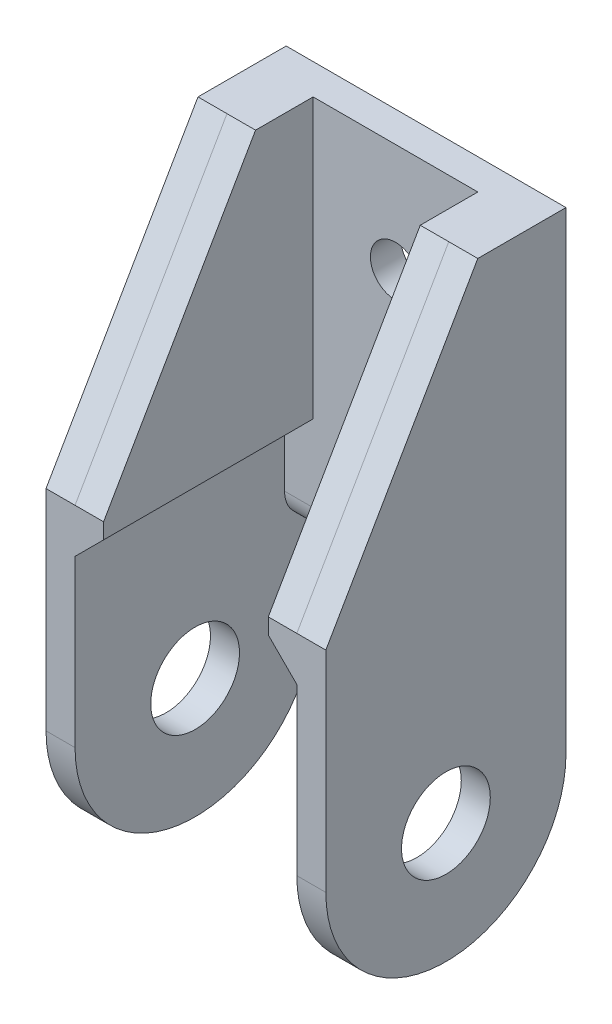
ISO-10303-21;
HEADER;
FILE_DESCRIPTION(('STEP AP214'),'2;1');
FILE_NAME('part.step','',(''),(''),'','','');
FILE_SCHEMA(('AUTOMOTIVE_DESIGN { 1 0 10303 214 1 1 1 1 }'));
ENDSEC;
DATA;
#1=APPLICATION_CONTEXT('core data for automotive mechanical design processes');
#2=APPLICATION_PROTOCOL_DEFINITION('international standard','automotive_design',2000,#1);
#3=PRODUCT_CONTEXT('',#1,'mechanical');
#4=PRODUCT('Part','Part','',(#3));
#5=PRODUCT_RELATED_PRODUCT_CATEGORY('part','',(#4));
#6=PRODUCT_DEFINITION_FORMATION('','',#4);
#7=PRODUCT_DEFINITION_CONTEXT('part definition',#1,'design');
#8=PRODUCT_DEFINITION('design','',#6,#7);
#9=PRODUCT_DEFINITION_SHAPE('','',#8);
#10=(LENGTH_UNIT() NAMED_UNIT(*) SI_UNIT(.MILLI.,.METRE.));
#11=(NAMED_UNIT(*) PLANE_ANGLE_UNIT() SI_UNIT($,.RADIAN.));
#12=(NAMED_UNIT(*) SI_UNIT($,.STERADIAN.) SOLID_ANGLE_UNIT());
#13=UNCERTAINTY_MEASURE_WITH_UNIT(LENGTH_MEASURE(1.E-05),#10,'distance_accuracy_value','');
#14=(GEOMETRIC_REPRESENTATION_CONTEXT(3) GLOBAL_UNCERTAINTY_ASSIGNED_CONTEXT((#13)) GLOBAL_UNIT_ASSIGNED_CONTEXT((#10,
#11,#12)) REPRESENTATION_CONTEXT('',''));
#15=CARTESIAN_POINT('',(0.,0.,0.));
#16=DIRECTION('',(0.,0.,1.));
#17=DIRECTION('',(1.,0.,0.));
#18=AXIS2_PLACEMENT_3D('',#15,#16,#17);
#19=CARTESIAN_POINT('',(8.92,19.9475,5.62207827597024));
#20=DIRECTION('',(0.,1.,0.));
#21=DIRECTION('',(1.,0.,0.));
#22=AXIS2_PLACEMENT_3D('',#19,#20,#21);
#23=PLANE('',#22);
#24=CARTESIAN_POINT('',(-8.92,19.9475,0.));
#25=CARTESIAN_POINT('',(8.92,19.9475,0.));
#26=(BOUNDED_CURVE() B_SPLINE_CURVE(1,(#24,#25),.UNSPECIFIED.,.F.,
.F.) B_SPLINE_CURVE_WITH_KNOTS((2,2),(-0.182,0.),
.UNSPECIFIED.) CURVE() GEOMETRIC_REPRESENTATION_ITEM() RATIONAL_B_SPLINE_CURVE((1.,1.)) REPRESENTATION_ITEM(''));
#27=CARTESIAN_POINT('',(-7.07,19.9475,0.));
#28=VERTEX_POINT('',#27);
#29=CARTESIAN_POINT('',(7.07,19.9475000013429,-1.55333731988172E-09));
#30=VERTEX_POINT('',#29);
#31=EDGE_CURVE('E145',#28,#30,#26,.T.);
#32=ORIENTED_EDGE('',*,*,#31,.F.);
#33=DIRECTION('',(1.,0.,0.));
#34=VECTOR('',#33,1.);
#35=CARTESIAN_POINT('',(-8.92,19.9475,0.));
#36=LINE('',#35,#34);
#37=CARTESIAN_POINT('',(-8.92,19.9475,0.));
#38=VERTEX_POINT('',#37);
#39=EDGE_CURVE('E445',#38,#28,#36,.T.);
#40=ORIENTED_EDGE('',*,*,#39,.F.);
#41=DIRECTION('',(0.,0.,-1.));
#42=VECTOR('',#41,1.);
#43=CARTESIAN_POINT('',(-8.92,19.9475,0.));
#44=LINE('',#43,#42);
#45=CARTESIAN_POINT('',(-8.92,19.9475,5.62206248299806));
#46=VERTEX_POINT('',#45);
#47=EDGE_CURVE('E458',#46,#38,#44,.T.);
#48=ORIENTED_EDGE('',*,*,#47,.F.);
#49=DIRECTION('',(1.,0.,0.));
#50=VECTOR('',#49,1.);
#51=CARTESIAN_POINT('',(-8.92,19.9475,5.62206248299806));
#52=LINE('',#51,#50);
#53=CARTESIAN_POINT('',(-7.07000000012178,19.9474899260201,5.62207179111762));
#54=VERTEX_POINT('',#53);
#55=EDGE_CURVE('E115',#46,#54,#52,.T.);
#56=ORIENTED_EDGE('',*,*,#55,.T.);
#57=CARTESIAN_POINT('',(-5.24999999999989,19.9474544202722,5.6220888046183));
#58=CARTESIAN_POINT('',(-6.47333333333323,19.9474696135148,5.6220800307449));
#59=CARTESIAN_POINT('',(-7.69666666666657,19.9474848067574,5.62207125687148));
#60=CARTESIAN_POINT('',(-8.92,19.9475,5.62206248299806));
#61=(BOUNDED_CURVE() B_SPLINE_CURVE(3,(#57,#58,#59,#60),.UNSPECIFIED.,.F.,
.F.) B_SPLINE_CURVE_WITH_KNOTS((4,4),(0.,1.82000000076109),
.UNSPECIFIED.) CURVE() GEOMETRIC_REPRESENTATION_ITEM() RATIONAL_B_SPLINE_CURVE((1.,1.,1.,1.)) REPRESENTATION_ITEM(''));
#62=CARTESIAN_POINT('',(-5.25,19.9474726521634,5.62207827597021));
#63=VERTEX_POINT('',#62);
#64=EDGE_CURVE('E105',#54,#63,#61,.F.);
#65=ORIENTED_EDGE('',*,*,#64,.T.);
#66=CARTESIAN_POINT('',(-5.25,19.9471392113303,1.94999997565309));
#67=DIRECTION('',(0.,9.08043904448818E-05,0.999999995877281));
#68=VECTOR('',#67,1.);
#69=LINE('',#66,#68);
#70=CARTESIAN_POINT('',(-5.25,19.9471392113303,1.94999997565309));
#71=VERTEX_POINT('',#70);
#72=EDGE_CURVE('E109',#71,#63,#69,.T.);
#73=ORIENTED_EDGE('',*,*,#72,.F.);
#74=CARTESIAN_POINT('',(-5.25,19.9475,1.94999997565309));
#75=DIRECTION('',(1.,0.,0.));
#76=VECTOR('',#75,1.);
#77=LINE('',#74,#76);
#78=CARTESIAN_POINT('',(5.25,19.9471392113302,1.94999997565309));
#79=VERTEX_POINT('',#78);
#80=EDGE_CURVE('E13',#71,#79,#77,.T.);
#81=ORIENTED_EDGE('',*,*,#80,.T.);
#82=CARTESIAN_POINT('',(5.25,19.9475,1.94999997565309));
#83=DIRECTION('',(0.,0.,1.));
#84=VECTOR('',#83,1.);
#85=LINE('',#82,#84);
#86=CARTESIAN_POINT('',(5.25,19.9474726521633,5.62207827597021));
#87=VERTEX_POINT('',#86);
#88=EDGE_CURVE('E64',#79,#87,#85,.T.);
#89=ORIENTED_EDGE('',*,*,#88,.T.);
#90=CARTESIAN_POINT('',(8.9199999999999,19.9475,5.62206248299806));
#91=CARTESIAN_POINT('',(7.69666666666656,19.9474848067574,5.62207125687148));
#92=CARTESIAN_POINT('',(6.47333333333323,19.9474696135148,5.6220800307449));
#93=CARTESIAN_POINT('',(5.2499999999999,19.9474544202722,5.6220888046183));
#94=(BOUNDED_CURVE() B_SPLINE_CURVE(3,(#90,#91,#92,#93),.UNSPECIFIED.,.F.,
.F.) B_SPLINE_CURVE_WITH_KNOTS((4,4),(0.,1.82000000076108),
.UNSPECIFIED.) CURVE() GEOMETRIC_REPRESENTATION_ITEM() RATIONAL_B_SPLINE_CURVE((1.,1.,1.,1.)) REPRESENTATION_ITEM(''));
#95=CARTESIAN_POINT('',(7.07,19.9474885122572,5.62206911700007));
#96=VERTEX_POINT('',#95);
#97=EDGE_CURVE('E122',#87,#96,#94,.F.);
#98=ORIENTED_EDGE('',*,*,#97,.T.);
#99=DIRECTION('',(-1.,0.,0.));
#100=VECTOR('',#99,1.);
#101=CARTESIAN_POINT('',(8.92,19.9475000013429,5.62206248377336));
#102=LINE('',#101,#100);
#103=CARTESIAN_POINT('',(8.92,19.9475000013429,5.62206248377336));
#104=VERTEX_POINT('',#103);
#105=EDGE_CURVE('E486',#104,#96,#102,.T.);
#106=ORIENTED_EDGE('',*,*,#105,.F.);
#107=DIRECTION('',(0.,0.,1.));
#108=VECTOR('',#107,1.);
#109=CARTESIAN_POINT('',(8.92,19.9475000013429,5.62206248377336));
#110=LINE('',#109,#108);
#111=CARTESIAN_POINT('',(8.92,19.9475000013429,-1.55333731988172E-09));
#112=VERTEX_POINT('',#111);
#113=EDGE_CURVE('E506',#112,#104,#110,.T.);
#114=ORIENTED_EDGE('',*,*,#113,.F.);
#115=DIRECTION('',(-1.,0.,0.));
#116=VECTOR('',#115,1.);
#117=CARTESIAN_POINT('',(8.92,19.9475000013429,-1.55333731988172E-09));
#118=LINE('',#117,#116);
#119=EDGE_CURVE('E482',#112,#30,#118,.T.);
#120=ORIENTED_EDGE('',*,*,#119,.T.);
#121=EDGE_LOOP('',(#32,#40,#48,#56,#65,#73,#81,#89,#98,#106,#114,#120));
#122=FACE_BOUND('',#121,.T.);
#123=ADVANCED_FACE('F53',(#122),#23,.T.);
#124=CARTESIAN_POINT('',(-8.92,-10.2125,0.));
#125=DIRECTION('',(0.,0.,-1.));
#126=DIRECTION('',(0.,-1.,0.));
#127=AXIS2_PLACEMENT_3D('',#124,#125,#126);
#128=PLANE('',#127);
#129=CARTESIAN_POINT('',(0.,12.9471392106589,0.));
#130=DIRECTION('',(0.,0.,-1.));
#131=DIRECTION('',(-1.,0.,0.));
#132=AXIS2_PLACEMENT_3D('',#129,#130,#131);
#133=CIRCLE('',#132,1.6);
#134=CARTESIAN_POINT('',(-1.6,12.9471392106589,0.));
#135=VERTEX_POINT('',#134);
#136=EDGE_CURVE('E517',#135,#135,#133,.T.);
#137=ORIENTED_EDGE('',*,*,#136,.F.);
#138=EDGE_LOOP('',(#137));
#139=FACE_BOUND('',#138,.T.);
#140=CARTESIAN_POINT('',(0.,3.94713921065887,0.));
#141=DIRECTION('',(0.,0.,-1.));
#142=DIRECTION('',(-1.,0.,0.));
#143=AXIS2_PLACEMENT_3D('',#140,#141,#142);
#144=CIRCLE('',#143,1.6);
#145=CARTESIAN_POINT('',(-1.6,3.94713921065887,0.));
#146=VERTEX_POINT('',#145);
#147=EDGE_CURVE('E514',#146,#146,#144,.T.);
#148=ORIENTED_EDGE('',*,*,#147,.F.);
#149=EDGE_LOOP('',(#148));
#150=FACE_BOUND('',#149,.T.);
#151=CARTESIAN_POINT('',(-7.07,-4.6825,0.));
#152=CARTESIAN_POINT('',(7.07,-4.6825,0.));
#153=(BOUNDED_CURVE() B_SPLINE_CURVE(1,(#151,#152),.UNSPECIFIED.,.F.,
.F.) B_SPLINE_CURVE_WITH_KNOTS((2,2),(55.538,57.452),
.UNSPECIFIED.) CURVE() GEOMETRIC_REPRESENTATION_ITEM() RATIONAL_B_SPLINE_CURVE((1.,1.)) REPRESENTATION_ITEM(''));
#154=CARTESIAN_POINT('',(-7.07,-4.6825,0.));
#155=VERTEX_POINT('',#154);
#156=CARTESIAN_POINT('',(7.07,-4.68249999999999,-1.55334015319048E-09));
#157=VERTEX_POINT('',#156);
#158=EDGE_CURVE('E324',#155,#157,#153,.T.);
#159=ORIENTED_EDGE('',*,*,#158,.F.);
#160=DIRECTION('',(0.,-1.,0.));
#161=VECTOR('',#160,1.);
#162=CARTESIAN_POINT('',(-7.07,-10.2125,0.));
#163=LINE('',#162,#161);
#164=CARTESIAN_POINT('',(-7.07,-10.2125,0.));
#165=VERTEX_POINT('',#164);
#166=EDGE_CURVE('E462',#155,#165,#163,.T.);
#167=ORIENTED_EDGE('',*,*,#166,.T.);
#168=DIRECTION('',(1.,0.,0.));
#169=VECTOR('',#168,1.);
#170=CARTESIAN_POINT('',(-8.92,-10.2125,0.));
#171=LINE('',#170,#169);
#172=CARTESIAN_POINT('',(-8.92,-10.2125,0.));
#173=VERTEX_POINT('',#172);
#174=EDGE_CURVE('E448',#173,#165,#171,.T.);
#175=ORIENTED_EDGE('',*,*,#174,.F.);
#176=DIRECTION('',(0.,-1.,0.));
#177=VECTOR('',#176,1.);
#178=CARTESIAN_POINT('',(-8.92,-10.2125,0.));
#179=LINE('',#178,#177);
#180=EDGE_CURVE('E475',#38,#173,#179,.T.);
#181=ORIENTED_EDGE('',*,*,#180,.F.);
#182=ORIENTED_EDGE('',*,*,#39,.T.);
#183=ORIENTED_EDGE('',*,*,#31,.T.);
#184=ORIENTED_EDGE('',*,*,#119,.F.);
#185=DIRECTION('',(0.,1.,0.));
#186=VECTOR('',#185,1.);
#187=CARTESIAN_POINT('',(8.92,19.9475000013429,-1.55333731988172E-09));
#188=LINE('',#187,#186);
#189=CARTESIAN_POINT('',(8.92,-10.2124598604409,-1.55334078932867E-09));
#190=VERTEX_POINT('',#189);
#191=EDGE_CURVE('E509',#190,#112,#188,.T.);
#192=ORIENTED_EDGE('',*,*,#191,.F.);
#193=DIRECTION('',(-1.,0.,0.));
#194=VECTOR('',#193,1.);
#195=CARTESIAN_POINT('',(8.92,-10.2124598604409,-1.55334078932867E-09));
#196=LINE('',#195,#194);
#197=CARTESIAN_POINT('',(7.07,-10.2124598604409,-1.55334078932867E-09));
#198=VERTEX_POINT('',#197);
#199=EDGE_CURVE('E465',#190,#198,#196,.T.);
#200=ORIENTED_EDGE('',*,*,#199,.T.);
#201=DIRECTION('',(0.,1.,0.));
#202=VECTOR('',#201,1.);
#203=CARTESIAN_POINT('',(7.07,19.9475000013429,-1.55333731988172E-09));
#204=LINE('',#203,#202);
#205=EDGE_CURVE('E495',#198,#157,#204,.T.);
#206=ORIENTED_EDGE('',*,*,#205,.T.);
#207=EDGE_LOOP('',(#159,#167,#175,#181,#182,#183,#184,#192,#200,#206));
#208=FACE_BOUND('',#207,.T.);
#209=ADVANCED_FACE('F188',(#139,#150,#208),#128,.T.);
#210=CARTESIAN_POINT('',(-8.92,10.2629827701714,15.31));
#211=DIRECTION('',(0.,0.,1.));
#212=DIRECTION('',(1.,0.,0.));
#213=AXIS2_PLACEMENT_3D('',#210,#211,#212);
#214=PLANE('',#213);
#215=CARTESIAN_POINT('',(-8.92,3.1675,15.31));
#216=CARTESIAN_POINT('',(-7.07,3.1675,15.31));
#217=CARTESIAN_POINT('',(-5.25,3.1675,15.31));
#218=(BOUNDED_CURVE() B_SPLINE_CURVE(1,(#215,#216,#217),.UNSPECIFIED.,.F.,
.F.) B_SPLINE_CURVE_WITH_KNOTS((2,1,2),(-1.82000000076109,-0.902561308279338,0.),
.UNSPECIFIED.) CURVE() GEOMETRIC_REPRESENTATION_ITEM() RATIONAL_B_SPLINE_CURVE((1.,1.,1.)) REPRESENTATION_ITEM(''));
#219=CARTESIAN_POINT('',(-7.07,3.1675,15.31));
#220=VERTEX_POINT('',#219);
#221=CARTESIAN_POINT('',(-5.25,3.1675,15.31));
#222=VERTEX_POINT('',#221);
#223=EDGE_CURVE('E123',#220,#222,#218,.T.);
#224=ORIENTED_EDGE('',*,*,#223,.F.);
#225=DIRECTION('',(1.,0.,0.));
#226=VECTOR('',#225,1.);
#227=CARTESIAN_POINT('',(-8.92,3.1675,15.31));
#228=LINE('',#227,#226);
#229=CARTESIAN_POINT('',(-8.92,3.1675,15.31));
#230=VERTEX_POINT('',#229);
#231=EDGE_CURVE('E454',#230,#220,#228,.T.);
#232=ORIENTED_EDGE('',*,*,#231,.F.);
#233=DIRECTION('',(0.,1.,0.));
#234=VECTOR('',#233,1.);
#235=CARTESIAN_POINT('',(-8.92,3.1675,15.31));
#236=LINE('',#235,#234);
#237=CARTESIAN_POINT('',(-8.92,-10.2125,15.31));
#238=VERTEX_POINT('',#237);
#239=EDGE_CURVE('E469',#238,#230,#236,.T.);
#240=ORIENTED_EDGE('',*,*,#239,.F.);
#241=DIRECTION('',(1.,0.,0.));
#242=VECTOR('',#241,1.);
#243=CARTESIAN_POINT('',(-8.92,-10.2125,15.31));
#244=LINE('',#243,#242);
#245=CARTESIAN_POINT('',(-7.07,-10.2125,15.31));
#246=VERTEX_POINT('',#245);
#247=EDGE_CURVE('E451',#238,#246,#244,.T.);
#248=ORIENTED_EDGE('',*,*,#247,.T.);
#249=DIRECTION('',(0.,1.,0.));
#250=VECTOR('',#249,1.);
#251=CARTESIAN_POINT('',(-7.07,3.1675,15.31));
#252=LINE('',#251,#250);
#253=CARTESIAN_POINT('',(-7.07,0.347499999999975,15.31));
#254=VERTEX_POINT('',#253);
#255=EDGE_CURVE('E455',#246,#254,#252,.T.);
#256=ORIENTED_EDGE('',*,*,#255,.T.);
#257=CARTESIAN_POINT('',(-5.25,2.1675,15.31));
#258=CARTESIAN_POINT('',(-7.07,0.347499999999975,15.31));
#259=(BOUNDED_CURVE() B_SPLINE_CURVE(1,(#257,#258),.UNSPECIFIED.,.F.,
.F.) B_SPLINE_CURVE_WITH_KNOTS((2,2),(-2.57386868351903,0.),
.UNSPECIFIED.) CURVE() GEOMETRIC_REPRESENTATION_ITEM() RATIONAL_B_SPLINE_CURVE((1.,1.)) REPRESENTATION_ITEM(''));
#260=CARTESIAN_POINT('',(-5.25,2.1675,15.31));
#261=VERTEX_POINT('',#260);
#262=EDGE_CURVE('E139',#261,#254,#259,.T.);
#263=ORIENTED_EDGE('',*,*,#262,.F.);
#264=CARTESIAN_POINT('',(-5.25,3.1675,15.31));
#265=CARTESIAN_POINT('',(-5.25,2.1675,15.31));
#266=(BOUNDED_CURVE() B_SPLINE_CURVE(1,(#264,#265),.UNSPECIFIED.,.F.,
.F.) B_SPLINE_CURVE_WITH_KNOTS((2,2),(1.03100000076109,1.13100000076109),
.UNSPECIFIED.) CURVE() GEOMETRIC_REPRESENTATION_ITEM() RATIONAL_B_SPLINE_CURVE((1.,1.)) REPRESENTATION_ITEM(''));
#267=EDGE_CURVE('E72',#222,#261,#266,.T.);
#268=ORIENTED_EDGE('',*,*,#267,.F.);
#269=EDGE_LOOP('',(#224,#232,#240,#248,#256,#263,#268));
#270=FACE_BOUND('',#269,.T.);
#271=ADVANCED_FACE('F191',(#270),#214,.T.);
#272=CARTESIAN_POINT('',(-5.25,3.1675,15.31));
#273=CARTESIAN_POINT('',(-6.47333333333334,3.1675,15.31));
#274=CARTESIAN_POINT('',(-7.69666666666668,3.1675,15.31));
#275=CARTESIAN_POINT('',(-8.92,3.1675,15.31));
#276=CARTESIAN_POINT('',(-5.24999999999989,19.9474544202722,5.6220888046183));
#277=CARTESIAN_POINT('',(-6.47333333333323,19.9474696135148,5.6220800307449));
#278=CARTESIAN_POINT('',(-7.69666666666657,19.9474848067574,5.62207125687148));
#279=CARTESIAN_POINT('',(-8.92,19.9475,5.62206248299806));
#280=(BOUNDED_SURFACE() B_SPLINE_SURFACE(1,3,((#272,#273,#274,#275),(#276,#277,#278,#279)),
.UNSPECIFIED.,.F.,.F.,.F.) B_SPLINE_SURFACE_WITH_KNOTS((2,2),(4,4),(0.,19.3758750340038),(0.,
1.82000000076109),.UNSPECIFIED.) GEOMETRIC_REPRESENTATION_ITEM() RATIONAL_B_SPLINE_SURFACE(((1.,
1.,1.,1.),(1.,1.,1.,1.))) REPRESENTATION_ITEM('') SURFACE());
#281=CARTESIAN_POINT('',(-7.07,3.1675,15.31));
#282=CARTESIAN_POINT('',(-7.07,19.9475,5.62206248299806));
#283=(BOUNDED_CURVE() B_SPLINE_CURVE(1,(#281,#282),.UNSPECIFIED.,.F.,
.F.) B_SPLINE_CURVE_WITH_KNOTS((2,2),(0.,19.3758750340038),
.UNSPECIFIED.) CURVE() GEOMETRIC_REPRESENTATION_ITEM() RATIONAL_B_SPLINE_CURVE((1.,1.)) REPRESENTATION_ITEM(''));
#284=EDGE_CURVE('E439',#220,#54,#283,.T.);
#285=CARTESIAN_POINT('',(-5.25,19.9474726521634,5.62207827597021));
#286=CARTESIAN_POINT('',(-5.25,3.1675,15.31));
#287=(BOUNDED_CURVE() B_SPLINE_CURVE(1,(#285,#286),.UNSPECIFIED.,.F.,
.F.) B_SPLINE_CURVE_WITH_KNOTS((2,2),(-19.3758750340038,0.),
.UNSPECIFIED.) CURVE() GEOMETRIC_REPRESENTATION_ITEM() RATIONAL_B_SPLINE_CURVE((1.,1.)) REPRESENTATION_ITEM(''));
#288=EDGE_CURVE('E129',#63,#222,#287,.T.);
#289=ORIENTED_EDGE('',*,*,#64,.F.);
#290=ORIENTED_EDGE('',*,*,#284,.F.);
#291=ORIENTED_EDGE('',*,*,#223,.T.);
#292=ORIENTED_EDGE('',*,*,#288,.F.);
#293=EDGE_LOOP('',(#289,#290,#291,#292));
#294=FACE_BOUND('',#293,.T.);
#295=ADVANCED_FACE('F136',(#294),#280,.T.);
#296=CARTESIAN_POINT('',(-18.92,10.2629827701714,15.31));
#297=DIRECTION('',(0.,0.,1.));
#298=DIRECTION('',(1.,0.,0.));
#299=AXIS2_PLACEMENT_3D('',#296,#297,#298);
#300=PLANE('',#299);
#301=CARTESIAN_POINT('',(7.07,0.347499999999975,15.31));
#302=CARTESIAN_POINT('',(5.25,2.1675,15.31));
#303=(BOUNDED_CURVE() B_SPLINE_CURVE(1,(#301,#302),.UNSPECIFIED.,.F.,
.F.) B_SPLINE_CURVE_WITH_KNOTS((2,2),(0.,2.57386868351903),
.UNSPECIFIED.) CURVE() GEOMETRIC_REPRESENTATION_ITEM() RATIONAL_B_SPLINE_CURVE((1.,1.)) REPRESENTATION_ITEM(''));
#304=CARTESIAN_POINT('',(7.07,0.347499999999972,15.3100000013433));
#305=VERTEX_POINT('',#304);
#306=CARTESIAN_POINT('',(5.25,2.1675,15.31));
#307=VERTEX_POINT('',#306);
#308=EDGE_CURVE('E622',#305,#307,#303,.T.);
#309=ORIENTED_EDGE('',*,*,#308,.F.);
#310=DIRECTION('',(0.,-1.,0.));
#311=VECTOR('',#310,1.);
#312=CARTESIAN_POINT('',(7.07,-10.2124598604409,15.3100000013429));
#313=LINE('',#312,#311);
#314=CARTESIAN_POINT('',(7.07,-10.2124598604409,15.3100000013429));
#315=VERTEX_POINT('',#314);
#316=EDGE_CURVE('E491',#305,#315,#313,.T.);
#317=ORIENTED_EDGE('',*,*,#316,.T.);
#318=DIRECTION('',(-1.,0.,0.));
#319=VECTOR('',#318,1.);
#320=CARTESIAN_POINT('',(8.92,-10.2124598604409,15.3100000013429));
#321=LINE('',#320,#319);
#322=CARTESIAN_POINT('',(8.92,-10.2124598604409,15.3100000013429));
#323=VERTEX_POINT('',#322);
#324=EDGE_CURVE('E487',#323,#315,#321,.T.);
#325=ORIENTED_EDGE('',*,*,#324,.F.);
#326=DIRECTION('',(0.,-1.,0.));
#327=VECTOR('',#326,1.);
#328=CARTESIAN_POINT('',(8.92,-10.2124598604409,15.3100000013429));
#329=LINE('',#328,#327);
#330=CARTESIAN_POINT('',(8.92,3.16750000035981,15.3100000013429));
#331=VERTEX_POINT('',#330);
#332=EDGE_CURVE('E490',#331,#323,#329,.T.);
#333=ORIENTED_EDGE('',*,*,#332,.F.);
#334=DIRECTION('',(-1.,0.,0.));
#335=VECTOR('',#334,1.);
#336=CARTESIAN_POINT('',(8.92,3.16750000035981,15.3100000013429));
#337=LINE('',#336,#335);
#338=CARTESIAN_POINT('',(7.07,3.16750000035981,15.3100000013429));
#339=VERTEX_POINT('',#338);
#340=EDGE_CURVE('E483',#331,#339,#337,.T.);
#341=ORIENTED_EDGE('',*,*,#340,.T.);
#342=CARTESIAN_POINT('',(5.25,3.1675,15.31));
#343=CARTESIAN_POINT('',(7.07,3.1675,15.31));
#344=CARTESIAN_POINT('',(8.92,3.1675,15.31));
#345=(BOUNDED_CURVE() B_SPLINE_CURVE(1,(#342,#343,#344),.UNSPECIFIED.,.F.,
.F.) B_SPLINE_CURVE_WITH_KNOTS((2,1,2),(-1.82000000076108,-0.917438692481745,0.),
.UNSPECIFIED.) CURVE() GEOMETRIC_REPRESENTATION_ITEM() RATIONAL_B_SPLINE_CURVE((1.,1.,1.)) REPRESENTATION_ITEM(''));
#346=CARTESIAN_POINT('',(5.25,3.1675,15.31));
#347=VERTEX_POINT('',#346);
#348=EDGE_CURVE('E703',#347,#339,#345,.T.);
#349=ORIENTED_EDGE('',*,*,#348,.F.);
#350=CARTESIAN_POINT('',(5.25,2.1675,15.31));
#351=CARTESIAN_POINT('',(5.25,3.1675,15.31));
#352=(BOUNDED_CURVE() B_SPLINE_CURVE(1,(#350,#351),.UNSPECIFIED.,.F.,
.F.) B_SPLINE_CURVE_WITH_KNOTS((2,2),(4.35386868351903,4.45386868351903),
.UNSPECIFIED.) CURVE() GEOMETRIC_REPRESENTATION_ITEM() RATIONAL_B_SPLINE_CURVE((1.,1.)) REPRESENTATION_ITEM(''));
#353=EDGE_CURVE('E224',#307,#347,#352,.T.);
#354=ORIENTED_EDGE('',*,*,#353,.F.);
#355=EDGE_LOOP('',(#309,#317,#325,#333,#341,#349,#354));
#356=FACE_BOUND('',#355,.T.);
#357=ADVANCED_FACE('F654',(#356),#300,.T.);
#358=CARTESIAN_POINT('',(8.92,3.1675,15.31));
#359=CARTESIAN_POINT('',(7.69666666666666,3.1675,15.31));
#360=CARTESIAN_POINT('',(6.47333333333333,3.1675,15.31));
#361=CARTESIAN_POINT('',(5.25,3.1675,15.31));
#362=CARTESIAN_POINT('',(8.9199999999999,19.9475,5.62206248299806));
#363=CARTESIAN_POINT('',(7.69666666666656,19.9474848067574,5.62207125687148));
#364=CARTESIAN_POINT('',(6.47333333333323,19.9474696135148,5.6220800307449));
#365=CARTESIAN_POINT('',(5.2499999999999,19.9474544202722,5.6220888046183));
#366=(BOUNDED_SURFACE() B_SPLINE_SURFACE(1,3,((#358,#359,#360,#361),(#362,#363,#364,#365)),
.UNSPECIFIED.,.F.,.F.,.F.) B_SPLINE_SURFACE_WITH_KNOTS((2,2),(4,4),(0.,19.3758750340038),(0.,
1.82000000076108),.UNSPECIFIED.) GEOMETRIC_REPRESENTATION_ITEM() RATIONAL_B_SPLINE_SURFACE(((1.,
1.,1.,1.),(1.,1.,1.,1.))) REPRESENTATION_ITEM('') SURFACE());
#367=CARTESIAN_POINT('',(7.07,3.16750000035981,15.3100000013429));
#368=CARTESIAN_POINT('',(7.07,4.45268169957763,14.5680000013458));
#369=CARTESIAN_POINT('',(7.07,5.73786339879465,13.8260000013474));
#370=CARTESIAN_POINT('',(7.07,9.17712091523428,11.840343748421));
#371=CARTESIAN_POINT('',(7.07,11.331196732456,10.5966874954914));
#372=CARTESIAN_POINT('',(7.07,15.639348366899,8.10937498963166));
#373=CARTESIAN_POINT('',(7.07,17.7934241841204,6.86571873670152));
#374=CARTESIAN_POINT('',(7.07,19.9475000013429,5.62206248377336));
#375=B_SPLINE_CURVE_WITH_KNOTS('',3,(#367,#368,#369,#370,#371,#372,#373,#374),.UNSPECIFIED.,.F.,
.F.,(4,2,2,4),(0.,4.45200000000001,11.9139375175695,19.375875035139),.UNSPECIFIED.);
#376=EDGE_CURVE('E417',#339,#96,#375,.T.);
#377=CARTESIAN_POINT('',(5.25,3.1675,15.31));
#378=CARTESIAN_POINT('',(5.25,19.9474726521633,5.62207827597021));
#379=(BOUNDED_CURVE() B_SPLINE_CURVE(1,(#377,#378),.UNSPECIFIED.,.F.,
.F.) B_SPLINE_CURVE_WITH_KNOTS((2,2),(0.,19.3758750340038),
.UNSPECIFIED.) CURVE() GEOMETRIC_REPRESENTATION_ITEM() RATIONAL_B_SPLINE_CURVE((1.,1.)) REPRESENTATION_ITEM(''));
#380=EDGE_CURVE('E215',#347,#87,#379,.T.);
#381=ORIENTED_EDGE('',*,*,#348,.T.);
#382=ORIENTED_EDGE('',*,*,#376,.T.);
#383=ORIENTED_EDGE('',*,*,#97,.F.);
#384=ORIENTED_EDGE('',*,*,#380,.F.);
#385=EDGE_LOOP('',(#381,#382,#383,#384));
#386=FACE_BOUND('',#385,.T.);
#387=ADVANCED_FACE('F757',(#386),#366,.T.);
#388=CARTESIAN_POINT('',(-12.0691047558312,-4.65160475583124,15.31));
#389=DIRECTION('',(0.707106781186547,-0.707106781186548,0.));
#390=DIRECTION('',(0.,0.,-1.));
#391=AXIS2_PLACEMENT_3D('',#388,#389,#390);
#392=PLANE('',#391);
#393=CARTESIAN_POINT('',(-7.07,0.347499999999975,1.95));
#394=CARTESIAN_POINT('',(-7.07,0.347499999999975,13.34));
#395=CARTESIAN_POINT('',(-7.07,0.347499999999975,15.31));
#396=(BOUNDED_CURVE() B_SPLINE_CURVE(1,(#393,#394,#395),.UNSPECIFIED.,.F.,
.F.) B_SPLINE_CURVE_WITH_KNOTS((2,1,2),(-1.139,0.,0.197),
.UNSPECIFIED.) CURVE() GEOMETRIC_REPRESENTATION_ITEM() RATIONAL_B_SPLINE_CURVE((1.,1.,1.)) REPRESENTATION_ITEM(''));
#397=CARTESIAN_POINT('',(-7.07,0.347499999999974,1.95));
#398=VERTEX_POINT('',#397);
#399=EDGE_CURVE('E252',#398,#254,#396,.T.);
#400=ORIENTED_EDGE('',*,*,#399,.F.);
#401=CARTESIAN_POINT('',(-5.25,2.1675,1.95));
#402=CARTESIAN_POINT('',(-7.07,0.347499999999975,1.95));
#403=(BOUNDED_CURVE() B_SPLINE_CURVE(1,(#401,#402),.UNSPECIFIED.,.F.,
.F.) B_SPLINE_CURVE_WITH_KNOTS((2,2),(0.,0.257386868351903),
.UNSPECIFIED.) CURVE() GEOMETRIC_REPRESENTATION_ITEM() RATIONAL_B_SPLINE_CURVE((1.,1.)) REPRESENTATION_ITEM(''));
#404=CARTESIAN_POINT('',(-5.25,2.1675,1.95));
#405=VERTEX_POINT('',#404);
#406=EDGE_CURVE('E332',#405,#398,#403,.T.);
#407=ORIENTED_EDGE('',*,*,#406,.F.);
#408=CARTESIAN_POINT('',(-5.25,2.1675,15.31));
#409=CARTESIAN_POINT('',(-5.25,2.1675,13.34));
#410=CARTESIAN_POINT('',(-5.25,2.1675,1.95));
#411=(BOUNDED_CURVE() B_SPLINE_CURVE(1,(#408,#409,#410),.UNSPECIFIED.,.F.,
.F.) B_SPLINE_CURVE_WITH_KNOTS((2,1,2),(-0.7655,-0.5685,0.5705),
.UNSPECIFIED.) CURVE() GEOMETRIC_REPRESENTATION_ITEM() RATIONAL_B_SPLINE_CURVE((1.,1.,1.)) REPRESENTATION_ITEM(''));
#412=EDGE_CURVE('E147',#261,#405,#411,.T.);
#413=ORIENTED_EDGE('',*,*,#412,.F.);
#414=ORIENTED_EDGE('',*,*,#262,.T.);
#415=EDGE_LOOP('',(#400,#407,#413,#414));
#416=FACE_BOUND('',#415,.T.);
#417=ADVANCED_FACE('F183',(#416),#392,.T.);
#418=CARTESIAN_POINT('',(-5.25,2.1675,0.));
#419=DIRECTION('',(1.,0.,0.));
#420=DIRECTION('',(0.,1.,0.));
#421=AXIS2_PLACEMENT_3D('',#418,#419,#420);
#422=PLANE('',#421);
#423=ORIENTED_EDGE('',*,*,#288,.T.);
#424=ORIENTED_EDGE('',*,*,#267,.T.);
#425=ORIENTED_EDGE('',*,*,#412,.T.);
#426=CARTESIAN_POINT('',(-5.25,2.1675,1.95));
#427=CARTESIAN_POINT('',(-5.25,4.61752485824371,1.949999996645));
#428=CARTESIAN_POINT('',(-5.25,13.1176111011301,1.94999998500523));
#429=CARTESIAN_POINT('',(-5.25,19.9471392113303,1.94999997565309));
#430=(BOUNDED_CURVE() B_SPLINE_CURVE(1,(#426,#427,#428,#429),.UNSPECIFIED.,.F.,
.F.) B_SPLINE_CURVE_WITH_KNOTS((2,1,1,2),(-0.245,0.,0.85,1.45),
.UNSPECIFIED.) CURVE() GEOMETRIC_REPRESENTATION_ITEM() RATIONAL_B_SPLINE_CURVE((1.,1.,1.,1.)) REPRESENTATION_ITEM(''));
#431=EDGE_CURVE('E131',#405,#71,#430,.T.);
#432=ORIENTED_EDGE('',*,*,#431,.T.);
#433=ORIENTED_EDGE('',*,*,#72,.T.);
#434=EDGE_LOOP('',(#423,#424,#425,#432,#433));
#435=FACE_BOUND('',#434,.T.);
#436=ADVANCED_FACE('F128',(#435),#422,.T.);
#437=CARTESIAN_POINT('',(12.0691047558312,-4.65160475583123,15.31));
#438=DIRECTION('',(-0.707106781186547,-0.707106781186548,0.));
#439=DIRECTION('',(-0.707106781186548,0.707106781186547,0.));
#440=AXIS2_PLACEMENT_3D('',#437,#438,#439);
#441=PLANE('',#440);
#442=ORIENTED_EDGE('',*,*,#308,.T.);
#443=CARTESIAN_POINT('',(5.25,2.1675,15.31));
#444=CARTESIAN_POINT('',(5.25,2.1675,13.34));
#445=CARTESIAN_POINT('',(5.25,2.1675,1.95));
#446=(BOUNDED_CURVE() B_SPLINE_CURVE(1,(#443,#444,#445),.UNSPECIFIED.,.F.,
.F.) B_SPLINE_CURVE_WITH_KNOTS((2,1,2),(-0.7655,-0.5685,0.5705),
.UNSPECIFIED.) CURVE() GEOMETRIC_REPRESENTATION_ITEM() RATIONAL_B_SPLINE_CURVE((1.,1.,1.)) REPRESENTATION_ITEM(''));
#447=CARTESIAN_POINT('',(5.25,2.1675,1.95));
#448=VERTEX_POINT('',#447);
#449=EDGE_CURVE('E293',#307,#448,#446,.T.);
#450=ORIENTED_EDGE('',*,*,#449,.T.);
#451=CARTESIAN_POINT('',(7.07,0.347499999999975,1.95));
#452=CARTESIAN_POINT('',(5.25,2.1675,1.95));
#453=(BOUNDED_CURVE() B_SPLINE_CURVE(1,(#451,#452),.UNSPECIFIED.,.F.,
.F.) B_SPLINE_CURVE_WITH_KNOTS((2,2),(-0.257386868351903,0.),
.UNSPECIFIED.) CURVE() GEOMETRIC_REPRESENTATION_ITEM() RATIONAL_B_SPLINE_CURVE((1.,1.)) REPRESENTATION_ITEM(''));
#454=CARTESIAN_POINT('',(7.07,0.347499999999975,1.95));
#455=VERTEX_POINT('',#454);
#456=EDGE_CURVE('E245',#455,#448,#453,.T.);
#457=ORIENTED_EDGE('',*,*,#456,.F.);
#458=CARTESIAN_POINT('',(7.07,0.347499999999975,1.95));
#459=CARTESIAN_POINT('',(7.07,0.347499999999975,13.34));
#460=CARTESIAN_POINT('',(7.07,0.347499999999975,15.31));
#461=(BOUNDED_CURVE() B_SPLINE_CURVE(1,(#458,#459,#460),.UNSPECIFIED.,.F.,
.F.) B_SPLINE_CURVE_WITH_KNOTS((2,1,2),(-1.139,0.,0.197),
.UNSPECIFIED.) CURVE() GEOMETRIC_REPRESENTATION_ITEM() RATIONAL_B_SPLINE_CURVE((1.,1.,1.)) REPRESENTATION_ITEM(''));
#462=EDGE_CURVE('E264',#455,#305,#461,.T.);
#463=ORIENTED_EDGE('',*,*,#462,.T.);
#464=EDGE_LOOP('',(#442,#450,#457,#463));
#465=FACE_BOUND('',#464,.T.);
#466=ADVANCED_FACE('F55',(#465),#441,.T.);
#467=CARTESIAN_POINT('',(5.25,2.1675,0.));
#468=DIRECTION('',(-1.,0.,0.));
#469=DIRECTION('',(0.,0.,1.));
#470=AXIS2_PLACEMENT_3D('',#467,#468,#469);
#471=PLANE('',#470);
#472=ORIENTED_EDGE('',*,*,#88,.F.);
#473=CARTESIAN_POINT('',(5.25,2.1675,1.95));
#474=CARTESIAN_POINT('',(5.25,4.61752485824371,1.949999996645));
#475=CARTESIAN_POINT('',(5.25,13.1176111011301,1.94999998500523));
#476=CARTESIAN_POINT('',(5.25,19.9471392113302,1.94999997565309));
#477=(BOUNDED_CURVE() B_SPLINE_CURVE(1,(#473,#474,#475,#476),.UNSPECIFIED.,.F.,
.F.) B_SPLINE_CURVE_WITH_KNOTS((2,1,1,2),(-0.245,0.,0.85,1.45),
.UNSPECIFIED.) CURVE() GEOMETRIC_REPRESENTATION_ITEM() RATIONAL_B_SPLINE_CURVE((1.,1.,1.,1.)) REPRESENTATION_ITEM(''));
#478=EDGE_CURVE('E251',#448,#79,#477,.T.);
#479=ORIENTED_EDGE('',*,*,#478,.F.);
#480=ORIENTED_EDGE('',*,*,#449,.F.);
#481=ORIENTED_EDGE('',*,*,#353,.T.);
#482=ORIENTED_EDGE('',*,*,#380,.T.);
#483=EDGE_LOOP('',(#472,#479,#480,#481,#482));
#484=FACE_BOUND('',#483,.T.);
#485=ADVANCED_FACE('F200',(#484),#471,.T.);
#486=CARTESIAN_POINT('',(-7.07,-2.7325,1.95));
#487=DIRECTION('',(0.,0.,1.));
#488=DIRECTION('',(1.,0.,0.));
#489=AXIS2_PLACEMENT_3D('',#486,#487,#488);
#490=PLANE('',#489);
#491=CARTESIAN_POINT('',(0.,12.9471392106589,1.95));
#492=DIRECTION('',(0.,0.,1.));
#493=DIRECTION('',(1.,0.,0.));
#494=AXIS2_PLACEMENT_3D('',#491,#492,#493);
#495=CIRCLE('',#494,1.6);
#496=CARTESIAN_POINT('',(1.6,12.9471392106589,1.95));
#497=VERTEX_POINT('',#496);
#498=EDGE_CURVE('E57',#497,#497,#495,.T.);
#499=ORIENTED_EDGE('',*,*,#498,.F.);
#500=EDGE_LOOP('',(#499));
#501=FACE_BOUND('',#500,.T.);
#502=CARTESIAN_POINT('',(0.,3.94713921065887,1.95));
#503=DIRECTION('',(0.,0.,1.));
#504=DIRECTION('',(1.,0.,0.));
#505=AXIS2_PLACEMENT_3D('',#502,#503,#504);
#506=CIRCLE('',#505,1.6);
#507=CARTESIAN_POINT('',(1.6,3.94713921065887,1.95));
#508=VERTEX_POINT('',#507);
#509=EDGE_CURVE('E521',#508,#508,#506,.T.);
#510=ORIENTED_EDGE('',*,*,#509,.F.);
#511=EDGE_LOOP('',(#510));
#512=FACE_BOUND('',#511,.T.);
#513=CARTESIAN_POINT('',(7.07,-2.7325,1.95));
#514=CARTESIAN_POINT('',(-7.07,-2.7325,1.95));
#515=(BOUNDED_CURVE() B_SPLINE_CURVE(1,(#513,#514),.UNSPECIFIED.,.F.,
.F.) B_SPLINE_CURVE_WITH_KNOTS((2,2),(0.,1.914),
.UNSPECIFIED.) CURVE() GEOMETRIC_REPRESENTATION_ITEM() RATIONAL_B_SPLINE_CURVE((1.,1.)) REPRESENTATION_ITEM(''));
#516=CARTESIAN_POINT('',(7.07,-2.7325,1.95));
#517=VERTEX_POINT('',#516);
#518=CARTESIAN_POINT('',(-7.07000000000001,-2.73250000000004,1.95));
#519=VERTEX_POINT('',#518);
#520=EDGE_CURVE('E795',#517,#519,#515,.T.);
#521=ORIENTED_EDGE('',*,*,#520,.F.);
#522=CARTESIAN_POINT('',(7.07,-2.7325,1.95));
#523=CARTESIAN_POINT('',(7.07,0.347499999999975,1.95));
#524=(BOUNDED_CURVE() B_SPLINE_CURVE(1,(#522,#523),.UNSPECIFIED.,.F.,
.F.) B_SPLINE_CURVE_WITH_KNOTS((2,2),(-0.308,0.),
.UNSPECIFIED.) CURVE() GEOMETRIC_REPRESENTATION_ITEM() RATIONAL_B_SPLINE_CURVE((1.,1.)) REPRESENTATION_ITEM(''));
#525=EDGE_CURVE('E225',#517,#455,#524,.T.);
#526=ORIENTED_EDGE('',*,*,#525,.T.);
#527=ORIENTED_EDGE('',*,*,#456,.T.);
#528=ORIENTED_EDGE('',*,*,#478,.T.);
#529=ORIENTED_EDGE('',*,*,#80,.F.);
#530=ORIENTED_EDGE('',*,*,#431,.F.);
#531=ORIENTED_EDGE('',*,*,#406,.T.);
#532=CARTESIAN_POINT('',(-7.07,-2.7325,1.95));
#533=CARTESIAN_POINT('',(-7.07,0.347499999999975,1.95));
#534=(BOUNDED_CURVE() B_SPLINE_CURVE(1,(#532,#533),.UNSPECIFIED.,.F.,
.F.) B_SPLINE_CURVE_WITH_KNOTS((2,2),(-0.308,0.),
.UNSPECIFIED.) CURVE() GEOMETRIC_REPRESENTATION_ITEM() RATIONAL_B_SPLINE_CURVE((1.,1.)) REPRESENTATION_ITEM(''));
#535=EDGE_CURVE('E777',#519,#398,#534,.T.);
#536=ORIENTED_EDGE('',*,*,#535,.F.);
#537=EDGE_LOOP('',(#521,#526,#527,#528,#529,#530,#531,#536));
#538=FACE_BOUND('',#537,.T.);
#539=ADVANCED_FACE('F198',(#501,#512,#538),#490,.T.);
#540=CARTESIAN_POINT('',(-8.57265203761757,-2.73250000000004,1.95));
#541=CARTESIAN_POINT('',(8.57265203761756,-2.7325,1.95000000000003));
#542=CARTESIAN_POINT('',(-8.57265203761757,-4.68250000000004,1.94999999999988));
#543=CARTESIAN_POINT('',(8.57265203761754,-4.68249999999994,1.95000000000014));
#544=CARTESIAN_POINT('',(-8.57265203761754,-4.6825,0.));
#545=CARTESIAN_POINT('',(8.57265203761756,-4.6825,0.));
#546=(BOUNDED_SURFACE() B_SPLINE_SURFACE(2,1,((#540,#541),(#542,#543),(#544,#545)),
.UNSPECIFIED.,.F.,.F.,.F.) B_SPLINE_SURFACE_WITH_KNOTS((3,3),(2,2),(1.5707963267949,
3.14159265358979),(0.,2.3208),
.UNSPECIFIED.) GEOMETRIC_REPRESENTATION_ITEM() RATIONAL_B_SPLINE_SURFACE(((1.,1.),
(0.707106781186548,0.707106781186548),(1.,1.))) REPRESENTATION_ITEM('') SURFACE());
#547=CARTESIAN_POINT('',(-7.07,-4.6825,0.));
#548=CARTESIAN_POINT('',(-7.07000000000001,-4.68250000000003,1.95));
#549=CARTESIAN_POINT('',(-7.07,-2.7325,1.95));
#550=(BOUNDED_CURVE() B_SPLINE_CURVE(2,(#547,#548,#549),.UNSPECIFIED.,.F.,
.F.) B_SPLINE_CURVE_WITH_KNOTS((3,3),(0.,0.306305283725005),
.UNSPECIFIED.) CURVE() GEOMETRIC_REPRESENTATION_ITEM() RATIONAL_B_SPLINE_CURVE((1.,
0.707106781186548,1.)) REPRESENTATION_ITEM(''));
#551=EDGE_CURVE('E133',#155,#519,#550,.T.);
#552=CARTESIAN_POINT('',(7.07,-4.6825,0.));
#553=CARTESIAN_POINT('',(7.07000000000001,-4.68250000000003,1.95));
#554=CARTESIAN_POINT('',(7.07,-2.7325,1.95));
#555=(BOUNDED_CURVE() B_SPLINE_CURVE(2,(#552,#553,#554),.UNSPECIFIED.,.F.,
.F.) B_SPLINE_CURVE_WITH_KNOTS((3,3),(-0.306305283725005,0.),
.UNSPECIFIED.) CURVE() GEOMETRIC_REPRESENTATION_ITEM() RATIONAL_B_SPLINE_CURVE((1.,
0.707106781186548,1.)) REPRESENTATION_ITEM(''));
#556=EDGE_CURVE('E333',#157,#517,#555,.T.);
#557=ORIENTED_EDGE('',*,*,#551,.F.);
#558=ORIENTED_EDGE('',*,*,#158,.T.);
#559=ORIENTED_EDGE('',*,*,#556,.T.);
#560=ORIENTED_EDGE('',*,*,#520,.T.);
#561=EDGE_LOOP('',(#557,#558,#559,#560));
#562=FACE_BOUND('',#561,.T.);
#563=ADVANCED_FACE('F193',(#562),#546,.T.);
#564=CARTESIAN_POINT('',(-8.92,-10.2125,7.655));
#565=DIRECTION('',(1.,0.,0.));
#566=DIRECTION('',(0.,0.,-1.));
#567=AXIS2_PLACEMENT_3D('',#564,#565,#566);
#568=CYLINDRICAL_SURFACE('',#567,7.655);
#569=CARTESIAN_POINT('',(-7.07,-10.2125,7.655));
#570=DIRECTION('',(-1.,0.,0.));
#571=DIRECTION('',(0.,0.,-1.));
#572=AXIS2_PLACEMENT_3D('',#569,#570,#571);
#573=CIRCLE('',#572,7.655);
#574=EDGE_CURVE('E459',#165,#246,#573,.T.);
#575=ORIENTED_EDGE('',*,*,#574,.T.);
#576=ORIENTED_EDGE('',*,*,#247,.F.);
#577=CARTESIAN_POINT('',(-8.92,-10.2125,7.655));
#578=DIRECTION('',(-1.,0.,0.));
#579=DIRECTION('',(0.,0.,-1.));
#580=AXIS2_PLACEMENT_3D('',#577,#578,#579);
#581=CIRCLE('',#580,7.655);
#582=EDGE_CURVE('E472',#173,#238,#581,.T.);
#583=ORIENTED_EDGE('',*,*,#582,.F.);
#584=ORIENTED_EDGE('',*,*,#174,.T.);
#585=EDGE_LOOP('',(#575,#576,#583,#584));
#586=FACE_BOUND('',#585,.T.);
#587=ADVANCED_FACE('F197',(#586),#568,.T.);
#588=CARTESIAN_POINT('',(-8.92,19.9475,5.62206248299806));
#589=DIRECTION('',(0.,-0.500000000000001,-0.866025403784438));
#590=DIRECTION('',(0.,0.866025403784438,-0.500000000000001));
#591=AXIS2_PLACEMENT_3D('',#588,#589,#590);
#592=PLANE('',#591);
#593=ORIENTED_EDGE('',*,*,#284,.T.);
#594=ORIENTED_EDGE('',*,*,#55,.F.);
#595=DIRECTION('',(0.,0.866025403784438,-0.500000000000001));
#596=VECTOR('',#595,1.);
#597=CARTESIAN_POINT('',(-8.92,19.9475,5.62206248299806));
#598=LINE('',#597,#596);
#599=EDGE_CURVE('E466',#230,#46,#598,.T.);
#600=ORIENTED_EDGE('',*,*,#599,.F.);
#601=ORIENTED_EDGE('',*,*,#231,.T.);
#602=EDGE_LOOP('',(#593,#594,#600,#601));
#603=FACE_BOUND('',#602,.T.);
#604=ADVANCED_FACE('F1186',(#603),#592,.F.);
#605=CARTESIAN_POINT('',(-8.92,-10.2125,7.655));
#606=DIRECTION('',(1.,0.,0.));
#607=DIRECTION('',(0.,0.,-1.));
#608=AXIS2_PLACEMENT_3D('',#605,#606,#607);
#609=PLANE('',#608);
#610=CARTESIAN_POINT('',(-8.92,-10.2125,7.655));
#611=DIRECTION('',(1.,0.,0.));
#612=DIRECTION('',(0.,0.,-1.));
#613=AXIS2_PLACEMENT_3D('',#610,#611,#612);
#614=CIRCLE('',#613,2.82999999999999);
#615=CARTESIAN_POINT('',(-8.92,-10.2125,4.82500000000001));
#616=VERTEX_POINT('',#615);
#617=EDGE_CURVE('E518',#616,#616,#614,.T.);
#618=ORIENTED_EDGE('',*,*,#617,.T.);
#619=EDGE_LOOP('',(#618));
#620=FACE_BOUND('',#619,.T.);
#621=ORIENTED_EDGE('',*,*,#47,.T.);
#622=ORIENTED_EDGE('',*,*,#180,.T.);
#623=ORIENTED_EDGE('',*,*,#582,.T.);
#624=ORIENTED_EDGE('',*,*,#239,.T.);
#625=ORIENTED_EDGE('',*,*,#599,.T.);
#626=EDGE_LOOP('',(#621,#622,#623,#624,#625));
#627=FACE_BOUND('',#626,.T.);
#628=ADVANCED_FACE('F1180',(#620,#627),#609,.F.);
#629=CARTESIAN_POINT('',(-7.07,-10.2125,7.655));
#630=DIRECTION('',(1.,0.,0.));
#631=DIRECTION('',(0.,0.,-1.));
#632=AXIS2_PLACEMENT_3D('',#629,#630,#631);
#633=PLANE('',#632);
#634=CARTESIAN_POINT('',(-7.07,-10.2125,7.655));
#635=DIRECTION('',(1.,0.,0.));
#636=DIRECTION('',(0.,0.,-1.));
#637=AXIS2_PLACEMENT_3D('',#634,#635,#636);
#638=CIRCLE('',#637,2.82999999999999);
#639=CARTESIAN_POINT('',(-7.07,-10.2125,4.82500000000001));
#640=VERTEX_POINT('',#639);
#641=EDGE_CURVE('E524',#640,#640,#638,.T.);
#642=ORIENTED_EDGE('',*,*,#641,.F.);
#643=EDGE_LOOP('',(#642));
#644=FACE_BOUND('',#643,.T.);
#645=ORIENTED_EDGE('',*,*,#166,.F.);
#646=ORIENTED_EDGE('',*,*,#551,.T.);
#647=ORIENTED_EDGE('',*,*,#535,.T.);
#648=ORIENTED_EDGE('',*,*,#399,.T.);
#649=ORIENTED_EDGE('',*,*,#255,.F.);
#650=ORIENTED_EDGE('',*,*,#574,.F.);
#651=EDGE_LOOP('',(#645,#646,#647,#648,#649,#650));
#652=FACE_BOUND('',#651,.T.);
#653=ADVANCED_FACE('F1185',(#644,#652),#633,.T.);
#654=CARTESIAN_POINT('',(7.07,-10.2124598604409,7.65499999989476));
#655=DIRECTION('',(-1.,0.,0.));
#656=DIRECTION('',(0.,0.,1.));
#657=AXIS2_PLACEMENT_3D('',#654,#655,#656);
#658=PLANE('',#657);
#659=CARTESIAN_POINT('',(7.07,-10.2125,7.655));
#660=DIRECTION('',(-1.,0.,0.));
#661=DIRECTION('',(0.,0.,1.));
#662=AXIS2_PLACEMENT_3D('',#659,#660,#661);
#663=CIRCLE('',#662,2.82999999999999);
#664=CARTESIAN_POINT('',(7.07,-10.2125,10.485));
#665=VERTEX_POINT('',#664);
#666=EDGE_CURVE('E527',#665,#665,#663,.T.);
#667=ORIENTED_EDGE('',*,*,#666,.F.);
#668=EDGE_LOOP('',(#667));
#669=FACE_BOUND('',#668,.T.);
#670=ORIENTED_EDGE('',*,*,#556,.F.);
#671=ORIENTED_EDGE('',*,*,#205,.F.);
#672=CARTESIAN_POINT('',(7.07,-10.2124598604409,7.65499999989476));
#673=DIRECTION('',(1.,0.,0.));
#674=DIRECTION('',(0.,0.,1.));
#675=AXIS2_PLACEMENT_3D('',#672,#673,#674);
#676=CIRCLE('',#675,7.6550000014481);
#677=EDGE_CURVE('E498',#315,#198,#676,.T.);
#678=ORIENTED_EDGE('',*,*,#677,.F.);
#679=ORIENTED_EDGE('',*,*,#316,.F.);
#680=ORIENTED_EDGE('',*,*,#462,.F.);
#681=ORIENTED_EDGE('',*,*,#525,.F.);
#682=EDGE_LOOP('',(#670,#671,#678,#679,#680,#681));
#683=FACE_BOUND('',#682,.T.);
#684=ADVANCED_FACE('F791',(#669,#683),#658,.T.);
#685=CARTESIAN_POINT('',(8.92,-10.2124598604409,7.65499999989476));
#686=DIRECTION('',(-1.,0.,0.));
#687=DIRECTION('',(0.,0.,1.));
#688=AXIS2_PLACEMENT_3D('',#685,#686,#687);
#689=CYLINDRICAL_SURFACE('',#688,7.6550000014481);
#690=ORIENTED_EDGE('',*,*,#677,.T.);
#691=ORIENTED_EDGE('',*,*,#199,.F.);
#692=CARTESIAN_POINT('',(8.92,-10.2124598604409,7.65499999989476));
#693=DIRECTION('',(1.,0.,0.));
#694=DIRECTION('',(0.,0.,1.));
#695=AXIS2_PLACEMENT_3D('',#692,#693,#694);
#696=CIRCLE('',#695,7.6550000014481);
#697=EDGE_CURVE('E494',#323,#190,#696,.T.);
#698=ORIENTED_EDGE('',*,*,#697,.F.);
#699=ORIENTED_EDGE('',*,*,#324,.T.);
#700=EDGE_LOOP('',(#690,#691,#698,#699));
#701=FACE_BOUND('',#700,.T.);
#702=ADVANCED_FACE('F554',(#701),#689,.T.);
#703=CARTESIAN_POINT('',(8.92,3.16750000035981,15.3100000013429));
#704=DIRECTION('',(0.,-0.500000000000001,-0.866025403784438));
#705=DIRECTION('',(0.,0.866025403784438,-0.500000000000001));
#706=AXIS2_PLACEMENT_3D('',#703,#704,#705);
#707=PLANE('',#706);
#708=ORIENTED_EDGE('',*,*,#376,.F.);
#709=ORIENTED_EDGE('',*,*,#340,.F.);
#710=DIRECTION('',(0.,-0.866025403784438,0.500000000000001));
#711=VECTOR('',#710,1.);
#712=CARTESIAN_POINT('',(8.92,3.16750000035981,15.3100000013429));
#713=LINE('',#712,#711);
#714=EDGE_CURVE('E503',#104,#331,#713,.T.);
#715=ORIENTED_EDGE('',*,*,#714,.F.);
#716=ORIENTED_EDGE('',*,*,#105,.T.);
#717=EDGE_LOOP('',(#708,#709,#715,#716));
#718=FACE_BOUND('',#717,.T.);
#719=ADVANCED_FACE('F540',(#718),#707,.F.);
#720=CARTESIAN_POINT('',(8.92,-10.2124598604409,7.65499999989476));
#721=DIRECTION('',(-1.,0.,0.));
#722=DIRECTION('',(0.,0.,1.));
#723=AXIS2_PLACEMENT_3D('',#720,#721,#722);
#724=PLANE('',#723);
#725=CARTESIAN_POINT('',(8.92,-10.2125,7.655));
#726=DIRECTION('',(1.,0.,0.));
#727=DIRECTION('',(0.,0.,-1.));
#728=AXIS2_PLACEMENT_3D('',#725,#726,#727);
#729=CIRCLE('',#728,2.82999999999999);
#730=CARTESIAN_POINT('',(8.92,-10.2125,4.82500000000001));
#731=VERTEX_POINT('',#730);
#732=EDGE_CURVE('E530',#731,#731,#729,.T.);
#733=ORIENTED_EDGE('',*,*,#732,.F.);
#734=EDGE_LOOP('',(#733));
#735=FACE_BOUND('',#734,.T.);
#736=ORIENTED_EDGE('',*,*,#697,.T.);
#737=ORIENTED_EDGE('',*,*,#191,.T.);
#738=ORIENTED_EDGE('',*,*,#113,.T.);
#739=ORIENTED_EDGE('',*,*,#714,.T.);
#740=ORIENTED_EDGE('',*,*,#332,.T.);
#741=EDGE_LOOP('',(#736,#737,#738,#739,#740));
#742=FACE_BOUND('',#741,.T.);
#743=ADVANCED_FACE('F536',(#735,#742),#724,.F.);
#744=CARTESIAN_POINT('',(0.,3.94713921065887,15.31005));
#745=DIRECTION('',(0.,0.,-1.));
#746=DIRECTION('',(-1.,0.,0.));
#747=AXIS2_PLACEMENT_3D('',#744,#745,#746);
#748=CYLINDRICAL_SURFACE('',#747,1.6);
#749=ORIENTED_EDGE('',*,*,#509,.T.);
#750=EDGE_LOOP('',(#749));
#751=FACE_BOUND('',#750,.T.);
#752=ORIENTED_EDGE('',*,*,#147,.T.);
#753=EDGE_LOOP('',(#752));
#754=FACE_BOUND('',#753,.T.);
#755=ADVANCED_FACE('F539',(#751,#754),#748,.F.);
#756=CARTESIAN_POINT('',(0.,12.9471392106589,15.31005));
#757=DIRECTION('',(0.,0.,-1.));
#758=DIRECTION('',(-1.,0.,0.));
#759=AXIS2_PLACEMENT_3D('',#756,#757,#758);
#760=CYLINDRICAL_SURFACE('',#759,1.6);
#761=ORIENTED_EDGE('',*,*,#498,.T.);
#762=EDGE_LOOP('',(#761));
#763=FACE_BOUND('',#762,.T.);
#764=ORIENTED_EDGE('',*,*,#136,.T.);
#765=EDGE_LOOP('',(#764));
#766=FACE_BOUND('',#765,.T.);
#767=ADVANCED_FACE('F749',(#763,#766),#760,.F.);
#768=CARTESIAN_POINT('',(-7.07,-10.2125,7.655));
#769=DIRECTION('',(1.,0.,0.));
#770=DIRECTION('',(0.,0.,-1.));
#771=AXIS2_PLACEMENT_3D('',#768,#769,#770);
#772=CYLINDRICAL_SURFACE('',#771,2.82999999999999);
#773=ORIENTED_EDGE('',*,*,#641,.T.);
#774=EDGE_LOOP('',(#773));
#775=FACE_BOUND('',#774,.T.);
#776=ORIENTED_EDGE('',*,*,#617,.F.);
#777=EDGE_LOOP('',(#776));
#778=FACE_BOUND('',#777,.T.);
#779=ADVANCED_FACE('F1173',(#775,#778),#772,.F.);
#780=CARTESIAN_POINT('',(8.92,-10.2125,7.655));
#781=DIRECTION('',(1.,0.,0.));
#782=DIRECTION('',(0.,0.,-1.));
#783=AXIS2_PLACEMENT_3D('',#780,#781,#782);
#784=CYLINDRICAL_SURFACE('',#783,2.82999999999999);
#785=ORIENTED_EDGE('',*,*,#666,.T.);
#786=EDGE_LOOP('',(#785));
#787=FACE_BOUND('',#786,.T.);
#788=ORIENTED_EDGE('',*,*,#732,.T.);
#789=EDGE_LOOP('',(#788));
#790=FACE_BOUND('',#789,.T.);
#791=ADVANCED_FACE('F534',(#787,#790),#784,.F.);
#792=CLOSED_SHELL('',(#123,#209,#271,#295,#357,#387,#417,#436,#466,#485,#539,#563,#587,#604,
#628,#653,#684,#702,#719,#743,#755,#767,#779,#791));
#793=MANIFOLD_SOLID_BREP('B2',#792);
#794=ADVANCED_BREP_SHAPE_REPRESENTATION('',(#18,#793),#14);
#795=SHAPE_DEFINITION_REPRESENTATION(#9,#794);
ENDSEC;
END-ISO-10303-21;
